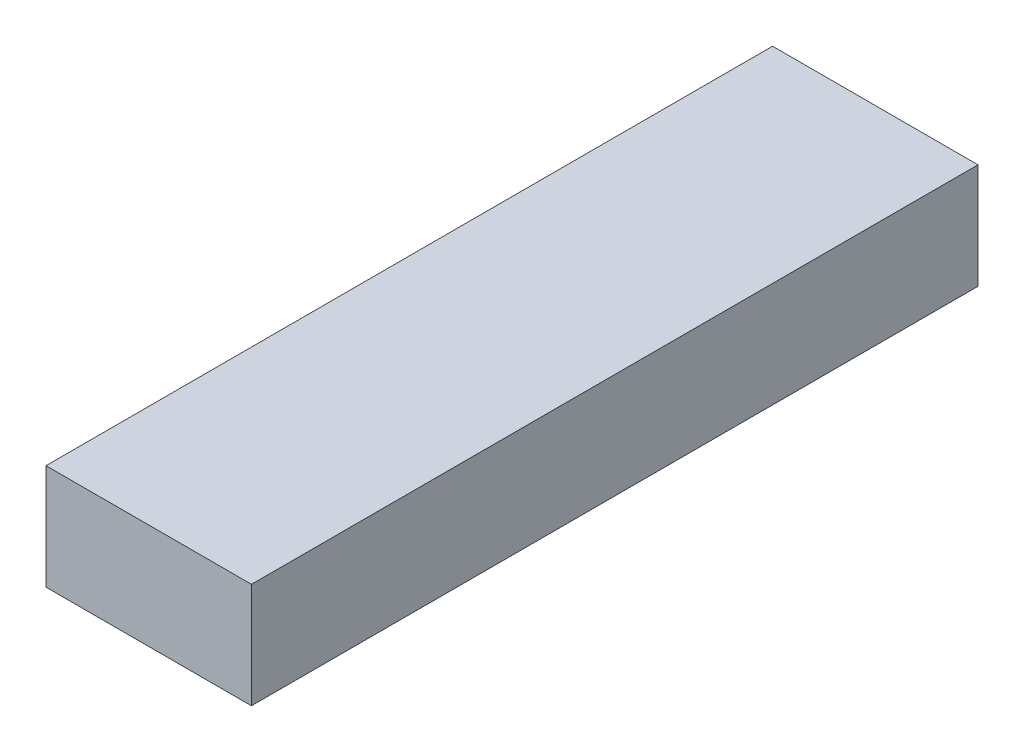
ISO-10303-21;
HEADER;
FILE_DESCRIPTION(('STEP AP214'),'2;1');
FILE_NAME('part.step','',(''),(''),'','','');
FILE_SCHEMA(('AUTOMOTIVE_DESIGN { 1 0 10303 214 1 1 1 1 }'));
ENDSEC;
DATA;
#1=APPLICATION_CONTEXT('core data for automotive mechanical design processes');
#2=APPLICATION_PROTOCOL_DEFINITION('international standard','automotive_design',2000,#1);
#3=PRODUCT_CONTEXT('',#1,'mechanical');
#4=PRODUCT('Part','Part','',(#3));
#5=PRODUCT_RELATED_PRODUCT_CATEGORY('part','',(#4));
#6=PRODUCT_DEFINITION_FORMATION('','',#4);
#7=PRODUCT_DEFINITION_CONTEXT('part definition',#1,'design');
#8=PRODUCT_DEFINITION('design','',#6,#7);
#9=PRODUCT_DEFINITION_SHAPE('','',#8);
#10=(LENGTH_UNIT() NAMED_UNIT(*) SI_UNIT(.MILLI.,.METRE.));
#11=(NAMED_UNIT(*) PLANE_ANGLE_UNIT() SI_UNIT($,.RADIAN.));
#12=(NAMED_UNIT(*) SI_UNIT($,.STERADIAN.) SOLID_ANGLE_UNIT());
#13=UNCERTAINTY_MEASURE_WITH_UNIT(LENGTH_MEASURE(1.E-05),#10,'distance_accuracy_value','');
#14=(GEOMETRIC_REPRESENTATION_CONTEXT(3) GLOBAL_UNCERTAINTY_ASSIGNED_CONTEXT((#13)) GLOBAL_UNIT_ASSIGNED_CONTEXT((#10,
#11,#12)) REPRESENTATION_CONTEXT('',''));
#15=CARTESIAN_POINT('',(0.,0.,0.));
#16=DIRECTION('',(0.,0.,1.));
#17=DIRECTION('',(1.,0.,0.));
#18=AXIS2_PLACEMENT_3D('',#15,#16,#17);
#19=CARTESIAN_POINT('',(20.5,10.5,145.));
#20=DIRECTION('',(-1.,0.,0.));
#21=DIRECTION('',(0.,0.,1.));
#22=AXIS2_PLACEMENT_3D('',#19,#20,#21);
#23=PLANE('',#22);
#24=DIRECTION('',(0.,1.,0.));
#25=VECTOR('',#24,1.);
#26=CARTESIAN_POINT('',(20.5,10.5,0.));
#27=LINE('',#26,#25);
#28=CARTESIAN_POINT('',(20.5,-10.5,0.));
#29=VERTEX_POINT('',#28);
#30=CARTESIAN_POINT('',(20.5,10.5,0.));
#31=VERTEX_POINT('',#30);
#32=EDGE_CURVE('E94',#29,#31,#27,.T.);
#33=ORIENTED_EDGE('',*,*,#32,.T.);
#34=DIRECTION('',(0.,0.,-1.));
#35=VECTOR('',#34,1.);
#36=CARTESIAN_POINT('',(20.5,10.5,145.));
#37=LINE('',#36,#35);
#38=CARTESIAN_POINT('',(20.5,10.5,145.));
#39=VERTEX_POINT('',#38);
#40=EDGE_CURVE('E11',#39,#31,#37,.T.);
#41=ORIENTED_EDGE('',*,*,#40,.F.);
#42=DIRECTION('',(0.,1.,0.));
#43=VECTOR('',#42,1.);
#44=CARTESIAN_POINT('',(20.5,10.5,145.));
#45=LINE('',#44,#43);
#46=CARTESIAN_POINT('',(20.5,-10.5,145.));
#47=VERTEX_POINT('',#46);
#48=EDGE_CURVE('E82',#47,#39,#45,.T.);
#49=ORIENTED_EDGE('',*,*,#48,.F.);
#50=DIRECTION('',(0.,0.,-1.));
#51=VECTOR('',#50,1.);
#52=CARTESIAN_POINT('',(20.5,-10.5,145.));
#53=LINE('',#52,#51);
#54=EDGE_CURVE('E90',#47,#29,#53,.T.);
#55=ORIENTED_EDGE('',*,*,#54,.T.);
#56=EDGE_LOOP('',(#33,#41,#49,#55));
#57=FACE_BOUND('',#56,.T.);
#58=ADVANCED_FACE('F31',(#57),#23,.F.);
#59=CARTESIAN_POINT('',(-20.5,10.5,145.));
#60=DIRECTION('',(0.,-1.,0.));
#61=DIRECTION('',(0.,0.,-1.));
#62=AXIS2_PLACEMENT_3D('',#59,#60,#61);
#63=PLANE('',#62);
#64=DIRECTION('',(-1.,0.,0.));
#65=VECTOR('',#64,1.);
#66=CARTESIAN_POINT('',(-20.5,10.5,0.));
#67=LINE('',#66,#65);
#68=CARTESIAN_POINT('',(-20.5,10.5,0.));
#69=VERTEX_POINT('',#68);
#70=EDGE_CURVE('E86',#31,#69,#67,.T.);
#71=ORIENTED_EDGE('',*,*,#70,.T.);
#72=DIRECTION('',(0.,0.,-1.));
#73=VECTOR('',#72,1.);
#74=CARTESIAN_POINT('',(-20.5,10.5,145.));
#75=LINE('',#74,#73);
#76=CARTESIAN_POINT('',(-20.5,10.5,145.));
#77=VERTEX_POINT('',#76);
#78=EDGE_CURVE('E39',#77,#69,#75,.T.);
#79=ORIENTED_EDGE('',*,*,#78,.F.);
#80=DIRECTION('',(-1.,0.,0.));
#81=VECTOR('',#80,1.);
#82=CARTESIAN_POINT('',(-20.5,10.5,145.));
#83=LINE('',#82,#81);
#84=EDGE_CURVE('E77',#39,#77,#83,.T.);
#85=ORIENTED_EDGE('',*,*,#84,.F.);
#86=ORIENTED_EDGE('',*,*,#40,.T.);
#87=EDGE_LOOP('',(#71,#79,#85,#86));
#88=FACE_BOUND('',#87,.T.);
#89=ADVANCED_FACE('F85',(#88),#63,.F.);
#90=CARTESIAN_POINT('',(-20.5,10.5,145.));
#91=DIRECTION('',(1.,0.,0.));
#92=DIRECTION('',(0.,0.,-1.));
#93=AXIS2_PLACEMENT_3D('',#90,#91,#92);
#94=PLANE('',#93);
#95=DIRECTION('',(0.,-1.,0.));
#96=VECTOR('',#95,1.);
#97=CARTESIAN_POINT('',(-20.5,10.5,0.));
#98=LINE('',#97,#96);
#99=CARTESIAN_POINT('',(-20.5,-10.5,0.));
#100=VERTEX_POINT('',#99);
#101=EDGE_CURVE('E64',#69,#100,#98,.T.);
#102=ORIENTED_EDGE('',*,*,#101,.T.);
#103=DIRECTION('',(0.,0.,-1.));
#104=VECTOR('',#103,1.);
#105=CARTESIAN_POINT('',(-20.5,-10.5,145.));
#106=LINE('',#105,#104);
#107=CARTESIAN_POINT('',(-20.5,-10.5,145.));
#108=VERTEX_POINT('',#107);
#109=EDGE_CURVE('E87',#108,#100,#106,.T.);
#110=ORIENTED_EDGE('',*,*,#109,.F.);
#111=DIRECTION('',(0.,-1.,0.));
#112=VECTOR('',#111,1.);
#113=CARTESIAN_POINT('',(-20.5,10.5,145.));
#114=LINE('',#113,#112);
#115=EDGE_CURVE('E80',#77,#108,#114,.T.);
#116=ORIENTED_EDGE('',*,*,#115,.F.);
#117=ORIENTED_EDGE('',*,*,#78,.T.);
#118=EDGE_LOOP('',(#102,#110,#116,#117));
#119=FACE_BOUND('',#118,.T.);
#120=ADVANCED_FACE('F88',(#119),#94,.F.);
#121=CARTESIAN_POINT('',(-20.5,-10.5,145.));
#122=DIRECTION('',(0.,1.,0.));
#123=DIRECTION('',(0.,0.,1.));
#124=AXIS2_PLACEMENT_3D('',#121,#122,#123);
#125=PLANE('',#124);
#126=DIRECTION('',(1.,0.,0.));
#127=VECTOR('',#126,1.);
#128=CARTESIAN_POINT('',(-20.5,-10.5,0.));
#129=LINE('',#128,#127);
#130=EDGE_CURVE('E70',#100,#29,#129,.T.);
#131=ORIENTED_EDGE('',*,*,#130,.T.);
#132=ORIENTED_EDGE('',*,*,#54,.F.);
#133=DIRECTION('',(1.,0.,0.));
#134=VECTOR('',#133,1.);
#135=CARTESIAN_POINT('',(-20.5,-10.5,145.));
#136=LINE('',#135,#134);
#137=EDGE_CURVE('E47',#108,#47,#136,.T.);
#138=ORIENTED_EDGE('',*,*,#137,.F.);
#139=ORIENTED_EDGE('',*,*,#109,.T.);
#140=EDGE_LOOP('',(#131,#132,#138,#139));
#141=FACE_BOUND('',#140,.T.);
#142=ADVANCED_FACE('F101',(#141),#125,.F.);
#143=CARTESIAN_POINT('',(20.5,-10.5,145.));
#144=DIRECTION('',(0.,0.,1.));
#145=DIRECTION('',(1.,0.,0.));
#146=AXIS2_PLACEMENT_3D('',#143,#144,#145);
#147=PLANE('',#146);
#148=ORIENTED_EDGE('',*,*,#48,.T.);
#149=ORIENTED_EDGE('',*,*,#84,.T.);
#150=ORIENTED_EDGE('',*,*,#115,.T.);
#151=ORIENTED_EDGE('',*,*,#137,.T.);
#152=EDGE_LOOP('',(#148,#149,#150,#151));
#153=FACE_BOUND('',#152,.T.);
#154=ADVANCED_FACE('F78',(#153),#147,.T.);
#155=CARTESIAN_POINT('',(20.5,-10.5,0.));
#156=DIRECTION('',(0.,0.,1.));
#157=DIRECTION('',(1.,0.,0.));
#158=AXIS2_PLACEMENT_3D('',#155,#156,#157);
#159=PLANE('',#158);
#160=ORIENTED_EDGE('',*,*,#32,.F.);
#161=ORIENTED_EDGE('',*,*,#130,.F.);
#162=ORIENTED_EDGE('',*,*,#101,.F.);
#163=ORIENTED_EDGE('',*,*,#70,.F.);
#164=EDGE_LOOP('',(#160,#161,#162,#163));
#165=FACE_BOUND('',#164,.T.);
#166=ADVANCED_FACE('F104',(#165),#159,.F.);
#167=CLOSED_SHELL('',(#58,#89,#120,#142,#154,#166));
#168=MANIFOLD_SOLID_BREP('B2',#167);
#169=ADVANCED_BREP_SHAPE_REPRESENTATION('',(#18,#168),#14);
#170=SHAPE_DEFINITION_REPRESENTATION(#9,#169);
ENDSEC;
END-ISO-10303-21;
